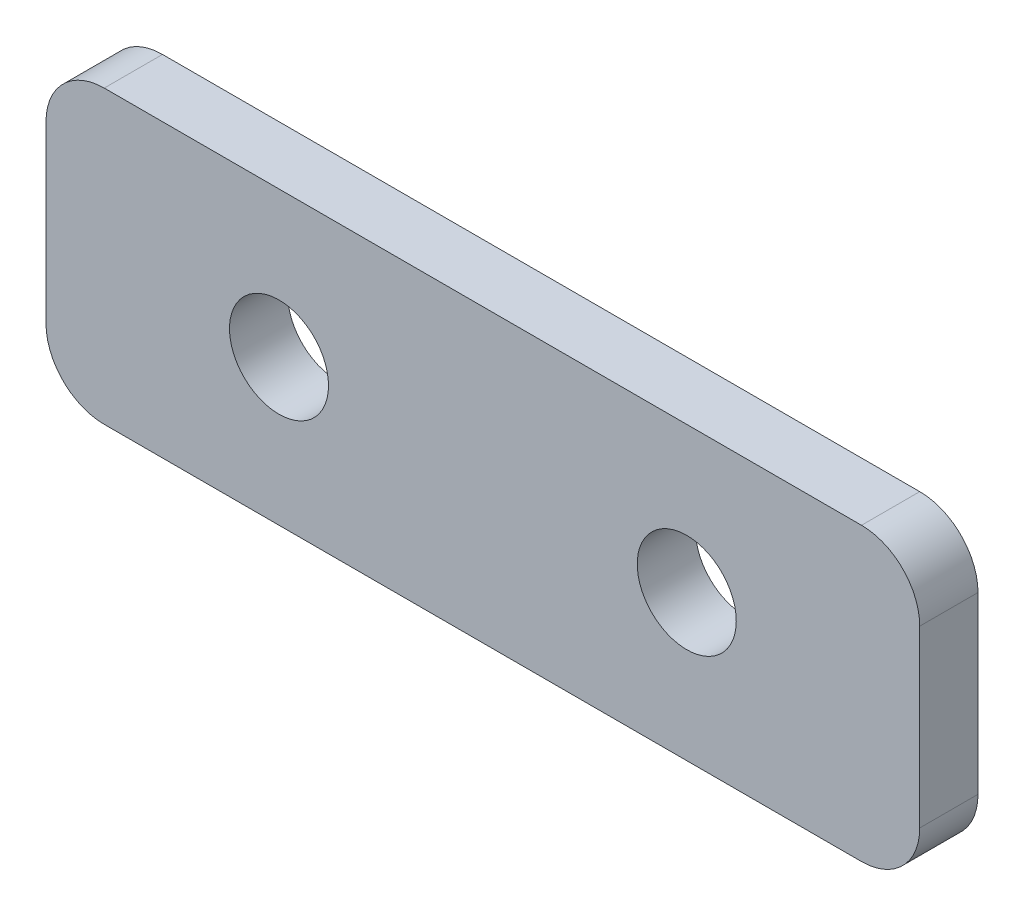
ISO-10303-21;
HEADER;
FILE_DESCRIPTION(('STEP AP214'),'2;1');
FILE_NAME('part.step','',(''),(''),'','','');
FILE_SCHEMA(('AUTOMOTIVE_DESIGN { 1 0 10303 214 1 1 1 1 }'));
ENDSEC;
DATA;
#1=APPLICATION_CONTEXT('core data for automotive mechanical design processes');
#2=APPLICATION_PROTOCOL_DEFINITION('international standard','automotive_design',2000,#1);
#3=PRODUCT_CONTEXT('',#1,'mechanical');
#4=PRODUCT('Part','Part','',(#3));
#5=PRODUCT_RELATED_PRODUCT_CATEGORY('part','',(#4));
#6=PRODUCT_DEFINITION_FORMATION('','',#4);
#7=PRODUCT_DEFINITION_CONTEXT('part definition',#1,'design');
#8=PRODUCT_DEFINITION('design','',#6,#7);
#9=PRODUCT_DEFINITION_SHAPE('','',#8);
#10=(LENGTH_UNIT() NAMED_UNIT(*) SI_UNIT(.MILLI.,.METRE.));
#11=(NAMED_UNIT(*) PLANE_ANGLE_UNIT() SI_UNIT($,.RADIAN.));
#12=(NAMED_UNIT(*) SI_UNIT($,.STERADIAN.) SOLID_ANGLE_UNIT());
#13=UNCERTAINTY_MEASURE_WITH_UNIT(LENGTH_MEASURE(1.E-05),#10,'distance_accuracy_value','');
#14=(GEOMETRIC_REPRESENTATION_CONTEXT(3) GLOBAL_UNCERTAINTY_ASSIGNED_CONTEXT((#13)) GLOBAL_UNIT_ASSIGNED_CONTEXT((#10,
#11,#12)) REPRESENTATION_CONTEXT('',''));
#15=CARTESIAN_POINT('',(0.,0.,0.));
#16=DIRECTION('',(0.,0.,1.));
#17=DIRECTION('',(1.,0.,0.));
#18=AXIS2_PLACEMENT_3D('',#15,#16,#17);
#19=CARTESIAN_POINT('',(15.,-5.,2.));
#20=DIRECTION('',(-1.,0.,0.));
#21=DIRECTION('',(0.,0.,1.));
#22=AXIS2_PLACEMENT_3D('',#19,#20,#21);
#23=PLANE('',#22);
#24=DIRECTION('',(0.,1.,0.));
#25=VECTOR('',#24,1.);
#26=CARTESIAN_POINT('',(15.,-5.,2.));
#27=LINE('',#26,#25);
#28=CARTESIAN_POINT('',(15.,-3.,2.));
#29=VERTEX_POINT('',#28);
#30=CARTESIAN_POINT('',(15.,3.,2.));
#31=VERTEX_POINT('',#30);
#32=EDGE_CURVE('E117',#29,#31,#27,.T.);
#33=ORIENTED_EDGE('',*,*,#32,.F.);
#34=DIRECTION('',(0.,0.,-1.));
#35=VECTOR('',#34,1.);
#36=CARTESIAN_POINT('',(15.,-3.,2.));
#37=LINE('',#36,#35);
#38=CARTESIAN_POINT('',(15.,-3.,0.));
#39=VERTEX_POINT('',#38);
#40=EDGE_CURVE('E102',#29,#39,#37,.T.);
#41=ORIENTED_EDGE('',*,*,#40,.T.);
#42=DIRECTION('',(0.,1.,0.));
#43=VECTOR('',#42,1.);
#44=CARTESIAN_POINT('',(15.,-5.,0.));
#45=LINE('',#44,#43);
#46=CARTESIAN_POINT('',(15.,3.,0.));
#47=VERTEX_POINT('',#46);
#48=EDGE_CURVE('E114',#39,#47,#45,.T.);
#49=ORIENTED_EDGE('',*,*,#48,.T.);
#50=DIRECTION('',(0.,0.,-1.));
#51=VECTOR('',#50,1.);
#52=CARTESIAN_POINT('',(15.,3.,2.));
#53=LINE('',#52,#51);
#54=EDGE_CURVE('E119',#47,#31,#53,.F.);
#55=ORIENTED_EDGE('',*,*,#54,.T.);
#56=EDGE_LOOP('',(#33,#41,#49,#55));
#57=FACE_BOUND('',#56,.T.);
#58=ADVANCED_FACE('F32',(#57),#23,.F.);
#59=CARTESIAN_POINT('',(-15.,5.,2.));
#60=DIRECTION('',(0.,-1.,0.));
#61=DIRECTION('',(0.,0.,-1.));
#62=AXIS2_PLACEMENT_3D('',#59,#60,#61);
#63=PLANE('',#62);
#64=DIRECTION('',(-1.,0.,0.));
#65=VECTOR('',#64,1.);
#66=CARTESIAN_POINT('',(-15.,5.,2.));
#67=LINE('',#66,#65);
#68=CARTESIAN_POINT('',(13.,5.,2.));
#69=VERTEX_POINT('',#68);
#70=CARTESIAN_POINT('',(-13.,5.,2.));
#71=VERTEX_POINT('',#70);
#72=EDGE_CURVE('E163',#69,#71,#67,.T.);
#73=ORIENTED_EDGE('',*,*,#72,.F.);
#74=DIRECTION('',(0.,0.,-1.));
#75=VECTOR('',#74,1.);
#76=CARTESIAN_POINT('',(13.,5.,2.));
#77=LINE('',#76,#75);
#78=CARTESIAN_POINT('',(13.,5.,0.));
#79=VERTEX_POINT('',#78);
#80=EDGE_CURVE('E156',#69,#79,#77,.T.);
#81=ORIENTED_EDGE('',*,*,#80,.T.);
#82=DIRECTION('',(-1.,0.,0.));
#83=VECTOR('',#82,1.);
#84=CARTESIAN_POINT('',(-15.,5.,0.));
#85=LINE('',#84,#83);
#86=CARTESIAN_POINT('',(-13.,5.,0.));
#87=VERTEX_POINT('',#86);
#88=EDGE_CURVE('E123',#79,#87,#85,.T.);
#89=ORIENTED_EDGE('',*,*,#88,.T.);
#90=DIRECTION('',(0.,0.,-1.));
#91=VECTOR('',#90,1.);
#92=CARTESIAN_POINT('',(-13.,5.,2.));
#93=LINE('',#92,#91);
#94=EDGE_CURVE('E154',#87,#71,#93,.F.);
#95=ORIENTED_EDGE('',*,*,#94,.T.);
#96=EDGE_LOOP('',(#73,#81,#89,#95));
#97=FACE_BOUND('',#96,.T.);
#98=ADVANCED_FACE('F161',(#97),#63,.F.);
#99=CARTESIAN_POINT('',(-15.,-5.,2.));
#100=DIRECTION('',(1.,0.,0.));
#101=DIRECTION('',(0.,0.,-1.));
#102=AXIS2_PLACEMENT_3D('',#99,#100,#101);
#103=PLANE('',#102);
#104=DIRECTION('',(0.,-1.,0.));
#105=VECTOR('',#104,1.);
#106=CARTESIAN_POINT('',(-15.,-5.,2.));
#107=LINE('',#106,#105);
#108=CARTESIAN_POINT('',(-15.,3.,2.));
#109=VERTEX_POINT('',#108);
#110=CARTESIAN_POINT('',(-15.,-3.,2.));
#111=VERTEX_POINT('',#110);
#112=EDGE_CURVE('E171',#109,#111,#107,.T.);
#113=ORIENTED_EDGE('',*,*,#112,.F.);
#114=DIRECTION('',(0.,0.,-1.));
#115=VECTOR('',#114,1.);
#116=CARTESIAN_POINT('',(-15.,3.,2.));
#117=LINE('',#116,#115);
#118=CARTESIAN_POINT('',(-15.,3.,0.));
#119=VERTEX_POINT('',#118);
#120=EDGE_CURVE('E11',#109,#119,#117,.T.);
#121=ORIENTED_EDGE('',*,*,#120,.T.);
#122=DIRECTION('',(0.,-1.,0.));
#123=VECTOR('',#122,1.);
#124=CARTESIAN_POINT('',(-15.,-5.,0.));
#125=LINE('',#124,#123);
#126=CARTESIAN_POINT('',(-15.,-3.,0.));
#127=VERTEX_POINT('',#126);
#128=EDGE_CURVE('E127',#119,#127,#125,.T.);
#129=ORIENTED_EDGE('',*,*,#128,.T.);
#130=DIRECTION('',(0.,0.,-1.));
#131=VECTOR('',#130,1.);
#132=CARTESIAN_POINT('',(-15.,-3.,2.));
#133=LINE('',#132,#131);
#134=EDGE_CURVE('E40',#127,#111,#133,.F.);
#135=ORIENTED_EDGE('',*,*,#134,.T.);
#136=EDGE_LOOP('',(#113,#121,#129,#135));
#137=FACE_BOUND('',#136,.T.);
#138=ADVANCED_FACE('F170',(#137),#103,.F.);
#139=CARTESIAN_POINT('',(-15.,-5.,2.));
#140=DIRECTION('',(0.,1.,0.));
#141=DIRECTION('',(0.,0.,1.));
#142=AXIS2_PLACEMENT_3D('',#139,#140,#141);
#143=PLANE('',#142);
#144=DIRECTION('',(1.,0.,0.));
#145=VECTOR('',#144,1.);
#146=CARTESIAN_POINT('',(-15.,-5.,0.));
#147=LINE('',#146,#145);
#148=CARTESIAN_POINT('',(-13.,-5.,0.));
#149=VERTEX_POINT('',#148);
#150=CARTESIAN_POINT('',(13.,-5.,0.));
#151=VERTEX_POINT('',#150);
#152=EDGE_CURVE('E137',#149,#151,#147,.T.);
#153=ORIENTED_EDGE('',*,*,#152,.T.);
#154=DIRECTION('',(0.,0.,-1.));
#155=VECTOR('',#154,1.);
#156=CARTESIAN_POINT('',(13.,-5.,2.));
#157=LINE('',#156,#155);
#158=CARTESIAN_POINT('',(13.,-5.,2.));
#159=VERTEX_POINT('',#158);
#160=EDGE_CURVE('E103',#151,#159,#157,.F.);
#161=ORIENTED_EDGE('',*,*,#160,.T.);
#162=DIRECTION('',(1.,0.,0.));
#163=VECTOR('',#162,1.);
#164=CARTESIAN_POINT('',(-15.,-5.,2.));
#165=LINE('',#164,#163);
#166=CARTESIAN_POINT('',(-13.,-5.,2.));
#167=VERTEX_POINT('',#166);
#168=EDGE_CURVE('E133',#167,#159,#165,.T.);
#169=ORIENTED_EDGE('',*,*,#168,.F.);
#170=DIRECTION('',(0.,0.,-1.));
#171=VECTOR('',#170,1.);
#172=CARTESIAN_POINT('',(-13.,-5.,2.));
#173=LINE('',#172,#171);
#174=EDGE_CURVE('E108',#167,#149,#173,.T.);
#175=ORIENTED_EDGE('',*,*,#174,.T.);
#176=EDGE_LOOP('',(#153,#161,#169,#175));
#177=FACE_BOUND('',#176,.T.);
#178=ADVANCED_FACE('F191',(#177),#143,.F.);
#179=CARTESIAN_POINT('',(0.,0.,2.));
#180=DIRECTION('',(0.,0.,-1.));
#181=DIRECTION('',(-1.,0.,0.));
#182=AXIS2_PLACEMENT_3D('',#179,#180,#181);
#183=PLANE('',#182);
#184=CARTESIAN_POINT('',(-7.,0.,2.));
#185=DIRECTION('',(0.,0.,1.));
#186=DIRECTION('',(1.,0.,0.));
#187=AXIS2_PLACEMENT_3D('',#184,#185,#186);
#188=CIRCLE('',#187,1.7);
#189=CARTESIAN_POINT('',(-5.3,0.,2.));
#190=VERTEX_POINT('',#189);
#191=EDGE_CURVE('E182',#190,#190,#188,.T.);
#192=ORIENTED_EDGE('',*,*,#191,.F.);
#193=EDGE_LOOP('',(#192));
#194=FACE_BOUND('',#193,.T.);
#195=CARTESIAN_POINT('',(7.,0.,2.));
#196=DIRECTION('',(0.,0.,1.));
#197=DIRECTION('',(1.,0.,0.));
#198=AXIS2_PLACEMENT_3D('',#195,#196,#197);
#199=CIRCLE('',#198,1.7);
#200=CARTESIAN_POINT('',(8.7,0.,2.));
#201=VERTEX_POINT('',#200);
#202=EDGE_CURVE('E130',#201,#201,#199,.T.);
#203=ORIENTED_EDGE('',*,*,#202,.F.);
#204=EDGE_LOOP('',(#203));
#205=FACE_BOUND('',#204,.T.);
#206=ORIENTED_EDGE('',*,*,#168,.T.);
#207=CARTESIAN_POINT('',(13.,-3.,2.));
#208=DIRECTION('',(0.,0.,-1.));
#209=DIRECTION('',(-1.,0.,0.));
#210=AXIS2_PLACEMENT_3D('',#207,#208,#209);
#211=CIRCLE('',#210,2.);
#212=EDGE_CURVE('E152',#159,#29,#211,.F.);
#213=ORIENTED_EDGE('',*,*,#212,.T.);
#214=ORIENTED_EDGE('',*,*,#32,.T.);
#215=CARTESIAN_POINT('',(13.,3.,2.));
#216=DIRECTION('',(0.,0.,-1.));
#217=DIRECTION('',(-1.,0.,0.));
#218=AXIS2_PLACEMENT_3D('',#215,#216,#217);
#219=CIRCLE('',#218,2.);
#220=EDGE_CURVE('E150',#31,#69,#219,.F.);
#221=ORIENTED_EDGE('',*,*,#220,.T.);
#222=ORIENTED_EDGE('',*,*,#72,.T.);
#223=CARTESIAN_POINT('',(-13.,3.,2.));
#224=DIRECTION('',(0.,0.,-1.));
#225=DIRECTION('',(-1.,0.,0.));
#226=AXIS2_PLACEMENT_3D('',#223,#224,#225);
#227=CIRCLE('',#226,2.);
#228=EDGE_CURVE('E53',#71,#109,#227,.F.);
#229=ORIENTED_EDGE('',*,*,#228,.T.);
#230=ORIENTED_EDGE('',*,*,#112,.T.);
#231=CARTESIAN_POINT('',(-13.,-3.,2.));
#232=DIRECTION('',(0.,0.,-1.));
#233=DIRECTION('',(-1.,0.,0.));
#234=AXIS2_PLACEMENT_3D('',#231,#232,#233);
#235=CIRCLE('',#234,2.);
#236=EDGE_CURVE('E147',#111,#167,#235,.F.);
#237=ORIENTED_EDGE('',*,*,#236,.T.);
#238=EDGE_LOOP('',(#206,#213,#214,#221,#222,#229,#230,#237));
#239=FACE_BOUND('',#238,.T.);
#240=ADVANCED_FACE('F188',(#194,#205,#239),#183,.F.);
#241=CARTESIAN_POINT('',(0.,0.,0.));
#242=DIRECTION('',(0.,0.,-1.));
#243=DIRECTION('',(-1.,0.,0.));
#244=AXIS2_PLACEMENT_3D('',#241,#242,#243);
#245=PLANE('',#244);
#246=CARTESIAN_POINT('',(-7.,0.,0.));
#247=DIRECTION('',(0.,0.,1.));
#248=DIRECTION('',(1.,0.,0.));
#249=AXIS2_PLACEMENT_3D('',#246,#247,#248);
#250=CIRCLE('',#249,1.7);
#251=CARTESIAN_POINT('',(-5.3,0.,0.));
#252=VERTEX_POINT('',#251);
#253=EDGE_CURVE('E179',#252,#252,#250,.T.);
#254=ORIENTED_EDGE('',*,*,#253,.T.);
#255=EDGE_LOOP('',(#254));
#256=FACE_BOUND('',#255,.T.);
#257=CARTESIAN_POINT('',(7.,0.,0.));
#258=DIRECTION('',(0.,0.,1.));
#259=DIRECTION('',(1.,0.,0.));
#260=AXIS2_PLACEMENT_3D('',#257,#258,#259);
#261=CIRCLE('',#260,1.7);
#262=CARTESIAN_POINT('',(8.7,0.,0.));
#263=VERTEX_POINT('',#262);
#264=EDGE_CURVE('E124',#263,#263,#261,.T.);
#265=ORIENTED_EDGE('',*,*,#264,.T.);
#266=EDGE_LOOP('',(#265));
#267=FACE_BOUND('',#266,.T.);
#268=ORIENTED_EDGE('',*,*,#48,.F.);
#269=CARTESIAN_POINT('',(13.,-3.,0.));
#270=DIRECTION('',(0.,0.,-1.));
#271=DIRECTION('',(-1.,0.,0.));
#272=AXIS2_PLACEMENT_3D('',#269,#270,#271);
#273=CIRCLE('',#272,2.);
#274=EDGE_CURVE('E98',#39,#151,#273,.T.);
#275=ORIENTED_EDGE('',*,*,#274,.T.);
#276=ORIENTED_EDGE('',*,*,#152,.F.);
#277=CARTESIAN_POINT('',(-13.,-3.,0.));
#278=DIRECTION('',(0.,0.,-1.));
#279=DIRECTION('',(-1.,0.,0.));
#280=AXIS2_PLACEMENT_3D('',#277,#278,#279);
#281=CIRCLE('',#280,2.);
#282=EDGE_CURVE('E118',#149,#127,#281,.T.);
#283=ORIENTED_EDGE('',*,*,#282,.T.);
#284=ORIENTED_EDGE('',*,*,#128,.F.);
#285=CARTESIAN_POINT('',(-13.,3.,0.));
#286=DIRECTION('',(0.,0.,-1.));
#287=DIRECTION('',(-1.,0.,0.));
#288=AXIS2_PLACEMENT_3D('',#285,#286,#287);
#289=CIRCLE('',#288,2.);
#290=EDGE_CURVE('E141',#119,#87,#289,.T.);
#291=ORIENTED_EDGE('',*,*,#290,.T.);
#292=ORIENTED_EDGE('',*,*,#88,.F.);
#293=CARTESIAN_POINT('',(13.,3.,0.));
#294=DIRECTION('',(0.,0.,-1.));
#295=DIRECTION('',(-1.,0.,0.));
#296=AXIS2_PLACEMENT_3D('',#293,#294,#295);
#297=CIRCLE('',#296,2.);
#298=EDGE_CURVE('E109',#79,#47,#297,.T.);
#299=ORIENTED_EDGE('',*,*,#298,.T.);
#300=EDGE_LOOP('',(#268,#275,#276,#283,#284,#291,#292,#299));
#301=FACE_BOUND('',#300,.T.);
#302=ADVANCED_FACE('F121',(#256,#267,#301),#245,.T.);
#303=CARTESIAN_POINT('',(13.,-3.,2.));
#304=DIRECTION('',(0.,0.,-1.));
#305=DIRECTION('',(-1.,0.,0.));
#306=AXIS2_PLACEMENT_3D('',#303,#304,#305);
#307=CYLINDRICAL_SURFACE('',#306,2.);
#308=ORIENTED_EDGE('',*,*,#212,.F.);
#309=ORIENTED_EDGE('',*,*,#160,.F.);
#310=ORIENTED_EDGE('',*,*,#274,.F.);
#311=ORIENTED_EDGE('',*,*,#40,.F.);
#312=EDGE_LOOP('',(#308,#309,#310,#311));
#313=FACE_BOUND('',#312,.T.);
#314=ADVANCED_FACE('F101',(#313),#307,.T.);
#315=CARTESIAN_POINT('',(13.,3.,2.));
#316=DIRECTION('',(0.,0.,-1.));
#317=DIRECTION('',(-1.,0.,0.));
#318=AXIS2_PLACEMENT_3D('',#315,#316,#317);
#319=CYLINDRICAL_SURFACE('',#318,2.);
#320=ORIENTED_EDGE('',*,*,#220,.F.);
#321=ORIENTED_EDGE('',*,*,#54,.F.);
#322=ORIENTED_EDGE('',*,*,#298,.F.);
#323=ORIENTED_EDGE('',*,*,#80,.F.);
#324=EDGE_LOOP('',(#320,#321,#322,#323));
#325=FACE_BOUND('',#324,.T.);
#326=ADVANCED_FACE('F206',(#325),#319,.T.);
#327=CARTESIAN_POINT('',(-13.,3.,2.));
#328=DIRECTION('',(0.,0.,-1.));
#329=DIRECTION('',(-1.,0.,0.));
#330=AXIS2_PLACEMENT_3D('',#327,#328,#329);
#331=CYLINDRICAL_SURFACE('',#330,2.);
#332=ORIENTED_EDGE('',*,*,#228,.F.);
#333=ORIENTED_EDGE('',*,*,#94,.F.);
#334=ORIENTED_EDGE('',*,*,#290,.F.);
#335=ORIENTED_EDGE('',*,*,#120,.F.);
#336=EDGE_LOOP('',(#332,#333,#334,#335));
#337=FACE_BOUND('',#336,.T.);
#338=ADVANCED_FACE('F169',(#337),#331,.T.);
#339=CARTESIAN_POINT('',(-13.,-3.,2.));
#340=DIRECTION('',(0.,0.,-1.));
#341=DIRECTION('',(-1.,0.,0.));
#342=AXIS2_PLACEMENT_3D('',#339,#340,#341);
#343=CYLINDRICAL_SURFACE('',#342,2.);
#344=ORIENTED_EDGE('',*,*,#236,.F.);
#345=ORIENTED_EDGE('',*,*,#134,.F.);
#346=ORIENTED_EDGE('',*,*,#282,.F.);
#347=ORIENTED_EDGE('',*,*,#174,.F.);
#348=EDGE_LOOP('',(#344,#345,#346,#347));
#349=FACE_BOUND('',#348,.T.);
#350=ADVANCED_FACE('F34',(#349),#343,.T.);
#351=CARTESIAN_POINT('',(7.,0.,2.));
#352=DIRECTION('',(0.,0.,1.));
#353=DIRECTION('',(1.,0.,0.));
#354=AXIS2_PLACEMENT_3D('',#351,#352,#353);
#355=CYLINDRICAL_SURFACE('',#354,1.7);
#356=ORIENTED_EDGE('',*,*,#264,.F.);
#357=EDGE_LOOP('',(#356));
#358=FACE_BOUND('',#357,.T.);
#359=ORIENTED_EDGE('',*,*,#202,.T.);
#360=EDGE_LOOP('',(#359));
#361=FACE_BOUND('',#360,.T.);
#362=ADVANCED_FACE('F199',(#358,#361),#355,.F.);
#363=CARTESIAN_POINT('',(-7.,0.,2.));
#364=DIRECTION('',(0.,0.,1.));
#365=DIRECTION('',(1.,0.,0.));
#366=AXIS2_PLACEMENT_3D('',#363,#364,#365);
#367=CYLINDRICAL_SURFACE('',#366,1.7);
#368=ORIENTED_EDGE('',*,*,#253,.F.);
#369=EDGE_LOOP('',(#368));
#370=FACE_BOUND('',#369,.T.);
#371=ORIENTED_EDGE('',*,*,#191,.T.);
#372=EDGE_LOOP('',(#371));
#373=FACE_BOUND('',#372,.T.);
#374=ADVANCED_FACE('F186',(#370,#373),#367,.F.);
#375=CLOSED_SHELL('',(#58,#98,#138,#178,#240,#302,#314,#326,#338,#350,#362,#374));
#376=MANIFOLD_SOLID_BREP('B2',#375);
#377=ADVANCED_BREP_SHAPE_REPRESENTATION('',(#18,#376),#14);
#378=SHAPE_DEFINITION_REPRESENTATION(#9,#377);
ENDSEC;
END-ISO-10303-21;
